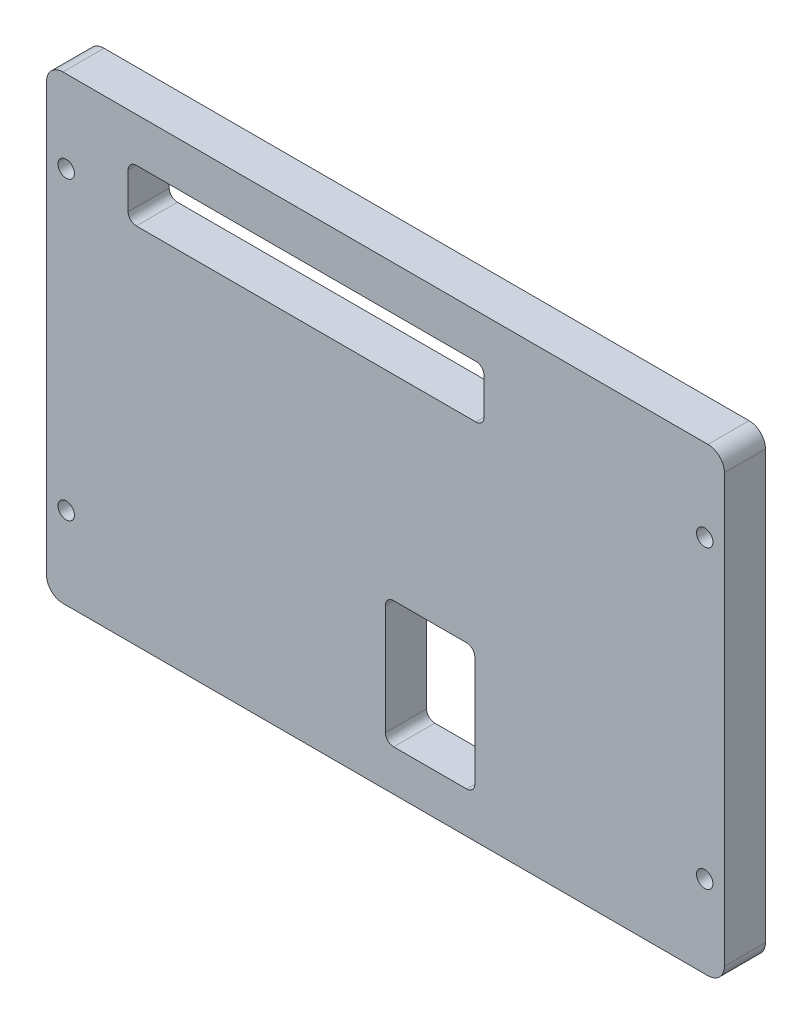
ISO-10303-21;
HEADER;
FILE_DESCRIPTION(('STEP AP214'),'2;1');
FILE_NAME('part.step','',(''),(''),'','','');
FILE_SCHEMA(('AUTOMOTIVE_DESIGN { 1 0 10303 214 1 1 1 1 }'));
ENDSEC;
DATA;
#1=APPLICATION_CONTEXT('core data for automotive mechanical design processes');
#2=APPLICATION_PROTOCOL_DEFINITION('international standard','automotive_design',2000,#1);
#3=PRODUCT_CONTEXT('',#1,'mechanical');
#4=PRODUCT('Part','Part','',(#3));
#5=PRODUCT_RELATED_PRODUCT_CATEGORY('part','',(#4));
#6=PRODUCT_DEFINITION_FORMATION('','',#4);
#7=PRODUCT_DEFINITION_CONTEXT('part definition',#1,'design');
#8=PRODUCT_DEFINITION('design','',#6,#7);
#9=PRODUCT_DEFINITION_SHAPE('','',#8);
#10=(LENGTH_UNIT() NAMED_UNIT(*) SI_UNIT(.MILLI.,.METRE.));
#11=(NAMED_UNIT(*) PLANE_ANGLE_UNIT() SI_UNIT($,.RADIAN.));
#12=(NAMED_UNIT(*) SI_UNIT($,.STERADIAN.) SOLID_ANGLE_UNIT());
#13=UNCERTAINTY_MEASURE_WITH_UNIT(LENGTH_MEASURE(1.E-05),#10,'distance_accuracy_value','');
#14=(GEOMETRIC_REPRESENTATION_CONTEXT(3) GLOBAL_UNCERTAINTY_ASSIGNED_CONTEXT((#13)) GLOBAL_UNIT_ASSIGNED_CONTEXT((#10,
#11,#12)) REPRESENTATION_CONTEXT('',''));
#15=CARTESIAN_POINT('',(0.,0.,0.));
#16=DIRECTION('',(0.,0.,1.));
#17=DIRECTION('',(1.,0.,0.));
#18=AXIS2_PLACEMENT_3D('',#15,#16,#17);
#19=CARTESIAN_POINT('',(49.8475,-33.02,6.35));
#20=DIRECTION('',(0.,0.,1.));
#21=DIRECTION('',(1.,0.,0.));
#22=AXIS2_PLACEMENT_3D('',#19,#20,#21);
#23=PLANE('',#22);
#24=CARTESIAN_POINT('',(49.3395,-22.86,6.35));
#25=DIRECTION('',(0.,0.,1.));
#26=DIRECTION('',(1.,0.,0.));
#27=AXIS2_PLACEMENT_3D('',#24,#25,#26);
#28=CIRCLE('',#27,1.27);
#29=CARTESIAN_POINT('',(50.6095,-22.86,6.35));
#30=VERTEX_POINT('',#29);
#31=EDGE_CURVE('E653',#30,#30,#28,.T.);
#32=ORIENTED_EDGE('',*,*,#31,.F.);
#33=EDGE_LOOP('',(#32));
#34=FACE_BOUND('',#33,.T.);
#35=CARTESIAN_POINT('',(49.3395,22.86,6.35));
#36=DIRECTION('',(0.,0.,1.));
#37=DIRECTION('',(1.,0.,0.));
#38=AXIS2_PLACEMENT_3D('',#35,#36,#37);
#39=CIRCLE('',#38,1.27);
#40=CARTESIAN_POINT('',(50.6095,22.86,6.35));
#41=VERTEX_POINT('',#40);
#42=EDGE_CURVE('E657',#41,#41,#39,.T.);
#43=ORIENTED_EDGE('',*,*,#42,.F.);
#44=EDGE_LOOP('',(#43));
#45=FACE_BOUND('',#44,.T.);
#46=CARTESIAN_POINT('',(-49.3395,22.86,6.35));
#47=DIRECTION('',(0.,0.,1.));
#48=DIRECTION('',(1.,0.,0.));
#49=AXIS2_PLACEMENT_3D('',#46,#47,#48);
#50=CIRCLE('',#49,1.27);
#51=CARTESIAN_POINT('',(-48.0695,22.86,6.35));
#52=VERTEX_POINT('',#51);
#53=EDGE_CURVE('E665',#52,#52,#50,.T.);
#54=ORIENTED_EDGE('',*,*,#53,.F.);
#55=EDGE_LOOP('',(#54));
#56=FACE_BOUND('',#55,.T.);
#57=CARTESIAN_POINT('',(-49.3395,-22.86,6.35));
#58=DIRECTION('',(0.,0.,1.));
#59=DIRECTION('',(1.,0.,0.));
#60=AXIS2_PLACEMENT_3D('',#57,#58,#59);
#61=CIRCLE('',#60,1.27);
#62=CARTESIAN_POINT('',(-48.0695,-22.86,6.35));
#63=VERTEX_POINT('',#62);
#64=EDGE_CURVE('E663',#63,#63,#61,.T.);
#65=ORIENTED_EDGE('',*,*,#64,.F.);
#66=EDGE_LOOP('',(#65));
#67=FACE_BOUND('',#66,.T.);
#68=CARTESIAN_POINT('',(49.8475,-33.02,6.35));
#69=DIRECTION('',(0.,0.,1.));
#70=DIRECTION('',(1.,0.,0.));
#71=AXIS2_PLACEMENT_3D('',#68,#69,#70);
#72=CIRCLE('',#71,2.54);
#73=CARTESIAN_POINT('',(49.8475,-35.56,6.35));
#74=VERTEX_POINT('',#73);
#75=CARTESIAN_POINT('',(52.3875,-33.02,6.35));
#76=VERTEX_POINT('',#75);
#77=EDGE_CURVE('E326',#74,#76,#72,.T.);
#78=ORIENTED_EDGE('',*,*,#77,.T.);
#79=DIRECTION('',(0.,1.,0.));
#80=VECTOR('',#79,1.);
#81=CARTESIAN_POINT('',(52.3875,-33.02,6.35));
#82=LINE('',#81,#80);
#83=CARTESIAN_POINT('',(52.3875,33.02,6.35));
#84=VERTEX_POINT('',#83);
#85=EDGE_CURVE('E329',#76,#84,#82,.T.);
#86=ORIENTED_EDGE('',*,*,#85,.T.);
#87=CARTESIAN_POINT('',(49.8475,33.02,6.35));
#88=DIRECTION('',(0.,0.,1.));
#89=DIRECTION('',(1.,0.,0.));
#90=AXIS2_PLACEMENT_3D('',#87,#88,#89);
#91=CIRCLE('',#90,2.54);
#92=CARTESIAN_POINT('',(49.8475,35.56,6.35));
#93=VERTEX_POINT('',#92);
#94=EDGE_CURVE('E332',#84,#93,#91,.T.);
#95=ORIENTED_EDGE('',*,*,#94,.T.);
#96=DIRECTION('',(-1.,0.,0.));
#97=VECTOR('',#96,1.);
#98=CARTESIAN_POINT('',(49.8475,35.56,6.35));
#99=LINE('',#98,#97);
#100=CARTESIAN_POINT('',(-49.8475,35.56,6.35));
#101=VERTEX_POINT('',#100);
#102=EDGE_CURVE('E334',#93,#101,#99,.T.);
#103=ORIENTED_EDGE('',*,*,#102,.T.);
#104=CARTESIAN_POINT('',(-49.8475,33.02,6.35));
#105=DIRECTION('',(0.,0.,1.));
#106=DIRECTION('',(1.,0.,0.));
#107=AXIS2_PLACEMENT_3D('',#104,#105,#106);
#108=CIRCLE('',#107,2.54);
#109=CARTESIAN_POINT('',(-52.3875,33.02,6.35));
#110=VERTEX_POINT('',#109);
#111=EDGE_CURVE('E336',#101,#110,#108,.T.);
#112=ORIENTED_EDGE('',*,*,#111,.T.);
#113=DIRECTION('',(0.,-1.,0.));
#114=VECTOR('',#113,1.);
#115=CARTESIAN_POINT('',(-52.3875,33.02,6.35));
#116=LINE('',#115,#114);
#117=CARTESIAN_POINT('',(-52.3875,-33.02,6.35));
#118=VERTEX_POINT('',#117);
#119=EDGE_CURVE('E338',#110,#118,#116,.T.);
#120=ORIENTED_EDGE('',*,*,#119,.T.);
#121=CARTESIAN_POINT('',(-49.8475,-33.02,6.35));
#122=DIRECTION('',(0.,0.,1.));
#123=DIRECTION('',(1.,0.,0.));
#124=AXIS2_PLACEMENT_3D('',#121,#122,#123);
#125=CIRCLE('',#124,2.54);
#126=CARTESIAN_POINT('',(-49.8475,-35.56,6.35));
#127=VERTEX_POINT('',#126);
#128=EDGE_CURVE('E340',#118,#127,#125,.T.);
#129=ORIENTED_EDGE('',*,*,#128,.T.);
#130=DIRECTION('',(1.,0.,0.));
#131=VECTOR('',#130,1.);
#132=CARTESIAN_POINT('',(-49.8475,-35.56,6.35));
#133=LINE('',#132,#131);
#134=EDGE_CURVE('E342',#127,#74,#133,.T.);
#135=ORIENTED_EDGE('',*,*,#134,.T.);
#136=EDGE_LOOP('',(#78,#86,#95,#103,#112,#120,#129,#135));
#137=FACE_BOUND('',#136,.T.);
#138=DIRECTION('',(0.,-1.,0.));
#139=VECTOR('',#138,1.);
#140=CARTESIAN_POINT('',(0.,-10.9162434669983,6.35));
#141=LINE('',#140,#139);
#142=CARTESIAN_POINT('',(0.,-10.9162434669983,6.35));
#143=VERTEX_POINT('',#142);
#144=CARTESIAN_POINT('',(0.,-27.94,6.35));
#145=VERTEX_POINT('',#144);
#146=EDGE_CURVE('E269',#143,#145,#141,.T.);
#147=ORIENTED_EDGE('',*,*,#146,.F.);
#148=CARTESIAN_POINT('',(1.27,-10.9162434669983,6.35));
#149=DIRECTION('',(0.,0.,1.));
#150=DIRECTION('',(1.,0.,0.));
#151=AXIS2_PLACEMENT_3D('',#148,#149,#150);
#152=CIRCLE('',#151,1.27);
#153=CARTESIAN_POINT('',(1.27000000000001,-9.64624346699828,6.35));
#154=VERTEX_POINT('',#153);
#155=EDGE_CURVE('E267',#154,#143,#152,.T.);
#156=ORIENTED_EDGE('',*,*,#155,.F.);
#157=DIRECTION('',(-1.,0.,0.));
#158=VECTOR('',#157,1.);
#159=CARTESIAN_POINT('',(1.27000000000001,-9.64624346699828,6.35));
#160=LINE('',#159,#158);
#161=CARTESIAN_POINT('',(12.5395183825614,-9.64624346699828,6.35));
#162=VERTEX_POINT('',#161);
#163=EDGE_CURVE('E283',#162,#154,#160,.T.);
#164=ORIENTED_EDGE('',*,*,#163,.F.);
#165=CARTESIAN_POINT('',(12.5395183825614,-10.9162434669983,6.35));
#166=DIRECTION('',(0.,0.,1.));
#167=DIRECTION('',(-1.,0.,0.));
#168=AXIS2_PLACEMENT_3D('',#165,#166,#167);
#169=CIRCLE('',#168,1.27);
#170=CARTESIAN_POINT('',(13.8095183825614,-10.9162434669983,6.35));
#171=VERTEX_POINT('',#170);
#172=EDGE_CURVE('E280',#171,#162,#169,.T.);
#173=ORIENTED_EDGE('',*,*,#172,.F.);
#174=DIRECTION('',(0.,1.,0.));
#175=VECTOR('',#174,1.);
#176=CARTESIAN_POINT('',(13.8095183825614,-10.9162434669983,6.35));
#177=LINE('',#176,#175);
#178=CARTESIAN_POINT('',(13.8095183825614,-27.94,6.35));
#179=VERTEX_POINT('',#178);
#180=EDGE_CURVE('E278',#179,#171,#177,.T.);
#181=ORIENTED_EDGE('',*,*,#180,.F.);
#182=CARTESIAN_POINT('',(12.5395183825614,-27.94,6.35));
#183=DIRECTION('',(0.,0.,1.));
#184=DIRECTION('',(1.,0.,0.));
#185=AXIS2_PLACEMENT_3D('',#182,#183,#184);
#186=CIRCLE('',#185,1.27);
#187=CARTESIAN_POINT('',(12.5395183825614,-29.21,6.35));
#188=VERTEX_POINT('',#187);
#189=EDGE_CURVE('E276',#188,#179,#186,.T.);
#190=ORIENTED_EDGE('',*,*,#189,.F.);
#191=DIRECTION('',(1.,0.,0.));
#192=VECTOR('',#191,1.);
#193=CARTESIAN_POINT('',(1.27000000000001,-29.21,6.35));
#194=LINE('',#193,#192);
#195=CARTESIAN_POINT('',(1.27000000000001,-29.21,6.35));
#196=VERTEX_POINT('',#195);
#197=EDGE_CURVE('E274',#196,#188,#194,.T.);
#198=ORIENTED_EDGE('',*,*,#197,.F.);
#199=CARTESIAN_POINT('',(1.27,-27.94,6.35));
#200=DIRECTION('',(0.,0.,1.));
#201=DIRECTION('',(1.,0.,0.));
#202=AXIS2_PLACEMENT_3D('',#199,#200,#201);
#203=CIRCLE('',#202,1.27);
#204=EDGE_CURVE('E272',#145,#196,#203,.T.);
#205=ORIENTED_EDGE('',*,*,#204,.F.);
#206=EDGE_LOOP('',(#147,#156,#164,#173,#181,#190,#198,#205));
#207=FACE_BOUND('',#206,.T.);
#208=DIRECTION('',(0.,-1.,0.));
#209=VECTOR('',#208,1.);
#210=CARTESIAN_POINT('',(-39.7723246205913,27.4662186761289,6.35));
#211=LINE('',#210,#209);
#212=CARTESIAN_POINT('',(-39.7723246205913,27.4662186761289,6.35));
#213=VERTEX_POINT('',#212);
#214=CARTESIAN_POINT('',(-39.7723246205913,21.8946585596287,6.35));
#215=VERTEX_POINT('',#214);
#216=EDGE_CURVE('E208',#213,#215,#211,.T.);
#217=ORIENTED_EDGE('',*,*,#216,.F.);
#218=CARTESIAN_POINT('',(-38.5023246205913,27.4662186761289,6.35));
#219=DIRECTION('',(0.,0.,1.));
#220=DIRECTION('',(1.,0.,0.));
#221=AXIS2_PLACEMENT_3D('',#218,#219,#220);
#222=CIRCLE('',#221,1.27);
#223=CARTESIAN_POINT('',(-38.5023246205913,28.7362186761289,6.35));
#224=VERTEX_POINT('',#223);
#225=EDGE_CURVE('E200',#224,#213,#222,.T.);
#226=ORIENTED_EDGE('',*,*,#225,.F.);
#227=DIRECTION('',(-1.,0.,0.));
#228=VECTOR('',#227,1.);
#229=CARTESIAN_POINT('',(-38.5023246205913,28.7362186761289,6.35));
#230=LINE('',#229,#228);
#231=CARTESIAN_POINT('',(13.9716720144704,28.7362186761289,6.35));
#232=VERTEX_POINT('',#231);
#233=EDGE_CURVE('E234',#232,#224,#230,.T.);
#234=ORIENTED_EDGE('',*,*,#233,.F.);
#235=CARTESIAN_POINT('',(13.9716720144705,27.4662186761289,6.35));
#236=DIRECTION('',(0.,0.,1.));
#237=DIRECTION('',(-1.,0.,0.));
#238=AXIS2_PLACEMENT_3D('',#235,#236,#237);
#239=CIRCLE('',#238,1.27);
#240=CARTESIAN_POINT('',(15.2416720144705,27.4662186761289,6.35));
#241=VERTEX_POINT('',#240);
#242=EDGE_CURVE('E232',#241,#232,#239,.T.);
#243=ORIENTED_EDGE('',*,*,#242,.F.);
#244=DIRECTION('',(0.,1.,0.));
#245=VECTOR('',#244,1.);
#246=CARTESIAN_POINT('',(15.2416720144705,27.4662186761289,6.35));
#247=LINE('',#246,#245);
#248=CARTESIAN_POINT('',(15.2416720144705,21.8946585596287,6.35));
#249=VERTEX_POINT('',#248);
#250=EDGE_CURVE('E230',#249,#241,#247,.T.);
#251=ORIENTED_EDGE('',*,*,#250,.F.);
#252=CARTESIAN_POINT('',(13.9716720144705,21.8946585596287,6.35));
#253=DIRECTION('',(0.,0.,1.));
#254=DIRECTION('',(1.,0.,0.));
#255=AXIS2_PLACEMENT_3D('',#252,#253,#254);
#256=CIRCLE('',#255,1.27);
#257=CARTESIAN_POINT('',(13.9716720144705,20.6246585596287,6.35));
#258=VERTEX_POINT('',#257);
#259=EDGE_CURVE('E228',#258,#249,#256,.T.);
#260=ORIENTED_EDGE('',*,*,#259,.F.);
#261=DIRECTION('',(1.,0.,0.));
#262=VECTOR('',#261,1.);
#263=CARTESIAN_POINT('',(-38.5023246205913,20.6246585596287,6.35));
#264=LINE('',#263,#262);
#265=CARTESIAN_POINT('',(-38.5023246205913,20.6246585596287,6.35));
#266=VERTEX_POINT('',#265);
#267=EDGE_CURVE('E223',#266,#258,#264,.T.);
#268=ORIENTED_EDGE('',*,*,#267,.F.);
#269=CARTESIAN_POINT('',(-38.5023246205913,21.8946585596287,6.35));
#270=DIRECTION('',(0.,0.,1.));
#271=DIRECTION('',(1.,0.,0.));
#272=AXIS2_PLACEMENT_3D('',#269,#270,#271);
#273=CIRCLE('',#272,1.27);
#274=EDGE_CURVE('E221',#215,#266,#273,.T.);
#275=ORIENTED_EDGE('',*,*,#274,.F.);
#276=EDGE_LOOP('',(#217,#226,#234,#243,#251,#260,#268,#275));
#277=FACE_BOUND('',#276,.T.);
#278=ADVANCED_FACE('F39',(#34,#45,#56,#67,#137,#207,#277),#23,.T.);
#279=CARTESIAN_POINT('',(49.8475,-33.02,0.));
#280=DIRECTION('',(0.,0.,1.));
#281=DIRECTION('',(1.,0.,0.));
#282=AXIS2_PLACEMENT_3D('',#279,#280,#281);
#283=PLANE('',#282);
#284=CARTESIAN_POINT('',(49.3395,-22.86,0.));
#285=DIRECTION('',(0.,0.,1.));
#286=DIRECTION('',(1.,0.,0.));
#287=AXIS2_PLACEMENT_3D('',#284,#285,#286);
#288=CIRCLE('',#287,1.27);
#289=CARTESIAN_POINT('',(50.6095,-22.86,0.));
#290=VERTEX_POINT('',#289);
#291=EDGE_CURVE('E651',#290,#290,#288,.T.);
#292=ORIENTED_EDGE('',*,*,#291,.T.);
#293=EDGE_LOOP('',(#292));
#294=FACE_BOUND('',#293,.T.);
#295=CARTESIAN_POINT('',(49.3395,22.86,0.));
#296=DIRECTION('',(0.,0.,1.));
#297=DIRECTION('',(1.,0.,0.));
#298=AXIS2_PLACEMENT_3D('',#295,#296,#297);
#299=CIRCLE('',#298,1.27);
#300=CARTESIAN_POINT('',(50.6095,22.86,0.));
#301=VERTEX_POINT('',#300);
#302=EDGE_CURVE('E654',#301,#301,#299,.T.);
#303=ORIENTED_EDGE('',*,*,#302,.T.);
#304=EDGE_LOOP('',(#303));
#305=FACE_BOUND('',#304,.T.);
#306=CARTESIAN_POINT('',(-49.3395,22.86,0.));
#307=DIRECTION('',(0.,0.,1.));
#308=DIRECTION('',(1.,0.,0.));
#309=AXIS2_PLACEMENT_3D('',#306,#307,#308);
#310=CIRCLE('',#309,1.27);
#311=CARTESIAN_POINT('',(-48.0695,22.86,0.));
#312=VERTEX_POINT('',#311);
#313=EDGE_CURVE('E669',#312,#312,#310,.T.);
#314=ORIENTED_EDGE('',*,*,#313,.T.);
#315=EDGE_LOOP('',(#314));
#316=FACE_BOUND('',#315,.T.);
#317=CARTESIAN_POINT('',(-49.3395,-22.86,0.));
#318=DIRECTION('',(0.,0.,1.));
#319=DIRECTION('',(1.,0.,0.));
#320=AXIS2_PLACEMENT_3D('',#317,#318,#319);
#321=CIRCLE('',#320,1.27);
#322=CARTESIAN_POINT('',(-48.0695,-22.86,0.));
#323=VERTEX_POINT('',#322);
#324=EDGE_CURVE('E237',#323,#323,#321,.T.);
#325=ORIENTED_EDGE('',*,*,#324,.T.);
#326=EDGE_LOOP('',(#325));
#327=FACE_BOUND('',#326,.T.);
#328=CARTESIAN_POINT('',(1.27,-10.9162434669983,0.));
#329=DIRECTION('',(0.,0.,1.));
#330=DIRECTION('',(1.,0.,0.));
#331=AXIS2_PLACEMENT_3D('',#328,#329,#330);
#332=CIRCLE('',#331,1.27);
#333=CARTESIAN_POINT('',(1.27000000000001,-9.64624346699828,0.));
#334=VERTEX_POINT('',#333);
#335=CARTESIAN_POINT('',(0.,-10.9162434669983,0.));
#336=VERTEX_POINT('',#335);
#337=EDGE_CURVE('E216',#334,#336,#332,.T.);
#338=ORIENTED_EDGE('',*,*,#337,.T.);
#339=DIRECTION('',(0.,-1.,0.));
#340=VECTOR('',#339,1.);
#341=CARTESIAN_POINT('',(0.,-10.9162434669983,0.));
#342=LINE('',#341,#340);
#343=CARTESIAN_POINT('',(0.,-27.94,0.));
#344=VERTEX_POINT('',#343);
#345=EDGE_CURVE('E288',#336,#344,#342,.T.);
#346=ORIENTED_EDGE('',*,*,#345,.T.);
#347=CARTESIAN_POINT('',(1.27,-27.94,0.));
#348=DIRECTION('',(0.,0.,1.));
#349=DIRECTION('',(1.,0.,0.));
#350=AXIS2_PLACEMENT_3D('',#347,#348,#349);
#351=CIRCLE('',#350,1.27);
#352=CARTESIAN_POINT('',(1.27000000000001,-29.21,0.));
#353=VERTEX_POINT('',#352);
#354=EDGE_CURVE('E291',#344,#353,#351,.T.);
#355=ORIENTED_EDGE('',*,*,#354,.T.);
#356=DIRECTION('',(1.,0.,0.));
#357=VECTOR('',#356,1.);
#358=CARTESIAN_POINT('',(1.27000000000001,-29.21,0.));
#359=LINE('',#358,#357);
#360=CARTESIAN_POINT('',(12.5395183825614,-29.21,0.));
#361=VERTEX_POINT('',#360);
#362=EDGE_CURVE('E294',#353,#361,#359,.T.);
#363=ORIENTED_EDGE('',*,*,#362,.T.);
#364=CARTESIAN_POINT('',(12.5395183825614,-27.94,0.));
#365=DIRECTION('',(0.,0.,1.));
#366=DIRECTION('',(1.,0.,0.));
#367=AXIS2_PLACEMENT_3D('',#364,#365,#366);
#368=CIRCLE('',#367,1.27);
#369=CARTESIAN_POINT('',(13.8095183825614,-27.94,0.));
#370=VERTEX_POINT('',#369);
#371=EDGE_CURVE('E297',#361,#370,#368,.T.);
#372=ORIENTED_EDGE('',*,*,#371,.T.);
#373=DIRECTION('',(0.,1.,0.));
#374=VECTOR('',#373,1.);
#375=CARTESIAN_POINT('',(13.8095183825614,-10.9162434669983,0.));
#376=LINE('',#375,#374);
#377=CARTESIAN_POINT('',(13.8095183825614,-10.9162434669983,0.));
#378=VERTEX_POINT('',#377);
#379=EDGE_CURVE('E300',#370,#378,#376,.T.);
#380=ORIENTED_EDGE('',*,*,#379,.T.);
#381=CARTESIAN_POINT('',(12.5395183825614,-10.9162434669983,0.));
#382=DIRECTION('',(0.,0.,1.));
#383=DIRECTION('',(-1.,0.,0.));
#384=AXIS2_PLACEMENT_3D('',#381,#382,#383);
#385=CIRCLE('',#384,1.27);
#386=CARTESIAN_POINT('',(12.5395183825614,-9.64624346699828,0.));
#387=VERTEX_POINT('',#386);
#388=EDGE_CURVE('E303',#378,#387,#385,.T.);
#389=ORIENTED_EDGE('',*,*,#388,.T.);
#390=DIRECTION('',(-1.,0.,0.));
#391=VECTOR('',#390,1.);
#392=CARTESIAN_POINT('',(1.27000000000001,-9.64624346699828,0.));
#393=LINE('',#392,#391);
#394=EDGE_CURVE('E270',#387,#334,#393,.T.);
#395=ORIENTED_EDGE('',*,*,#394,.T.);
#396=EDGE_LOOP('',(#338,#346,#355,#363,#372,#380,#389,#395));
#397=FACE_BOUND('',#396,.T.);
#398=CARTESIAN_POINT('',(49.8475,-33.02,0.));
#399=DIRECTION('',(0.,0.,1.));
#400=DIRECTION('',(1.,0.,0.));
#401=AXIS2_PLACEMENT_3D('',#398,#399,#400);
#402=CIRCLE('',#401,2.54);
#403=CARTESIAN_POINT('',(49.8475,-35.56,0.));
#404=VERTEX_POINT('',#403);
#405=CARTESIAN_POINT('',(52.3875,-33.02,0.));
#406=VERTEX_POINT('',#405);
#407=EDGE_CURVE('E325',#404,#406,#402,.T.);
#408=ORIENTED_EDGE('',*,*,#407,.F.);
#409=DIRECTION('',(1.,0.,0.));
#410=VECTOR('',#409,1.);
#411=CARTESIAN_POINT('',(-49.8475,-35.56,0.));
#412=LINE('',#411,#410);
#413=CARTESIAN_POINT('',(-49.8475,-35.56,0.));
#414=VERTEX_POINT('',#413);
#415=EDGE_CURVE('E330',#414,#404,#412,.T.);
#416=ORIENTED_EDGE('',*,*,#415,.F.);
#417=CARTESIAN_POINT('',(-49.8475,-33.02,0.));
#418=DIRECTION('',(0.,0.,1.));
#419=DIRECTION('',(1.,0.,0.));
#420=AXIS2_PLACEMENT_3D('',#417,#418,#419);
#421=CIRCLE('',#420,2.54);
#422=CARTESIAN_POINT('',(-52.3875,-33.02,0.));
#423=VERTEX_POINT('',#422);
#424=EDGE_CURVE('E357',#423,#414,#421,.T.);
#425=ORIENTED_EDGE('',*,*,#424,.F.);
#426=DIRECTION('',(0.,-1.,0.));
#427=VECTOR('',#426,1.);
#428=CARTESIAN_POINT('',(-52.3875,33.02,0.));
#429=LINE('',#428,#427);
#430=CARTESIAN_POINT('',(-52.3875,33.02,0.));
#431=VERTEX_POINT('',#430);
#432=EDGE_CURVE('E355',#431,#423,#429,.T.);
#433=ORIENTED_EDGE('',*,*,#432,.F.);
#434=CARTESIAN_POINT('',(-49.8475,33.02,0.));
#435=DIRECTION('',(0.,0.,1.));
#436=DIRECTION('',(1.,0.,0.));
#437=AXIS2_PLACEMENT_3D('',#434,#435,#436);
#438=CIRCLE('',#437,2.54);
#439=CARTESIAN_POINT('',(-49.8475,35.56,0.));
#440=VERTEX_POINT('',#439);
#441=EDGE_CURVE('E353',#440,#431,#438,.T.);
#442=ORIENTED_EDGE('',*,*,#441,.F.);
#443=DIRECTION('',(-1.,0.,0.));
#444=VECTOR('',#443,1.);
#445=CARTESIAN_POINT('',(49.8475,35.56,0.));
#446=LINE('',#445,#444);
#447=CARTESIAN_POINT('',(49.8475,35.56,0.));
#448=VERTEX_POINT('',#447);
#449=EDGE_CURVE('E351',#448,#440,#446,.T.);
#450=ORIENTED_EDGE('',*,*,#449,.F.);
#451=CARTESIAN_POINT('',(49.8475,33.02,0.));
#452=DIRECTION('',(0.,0.,1.));
#453=DIRECTION('',(1.,0.,0.));
#454=AXIS2_PLACEMENT_3D('',#451,#452,#453);
#455=CIRCLE('',#454,2.54);
#456=CARTESIAN_POINT('',(52.3875,33.02,0.));
#457=VERTEX_POINT('',#456);
#458=EDGE_CURVE('E349',#457,#448,#455,.T.);
#459=ORIENTED_EDGE('',*,*,#458,.F.);
#460=DIRECTION('',(0.,1.,0.));
#461=VECTOR('',#460,1.);
#462=CARTESIAN_POINT('',(52.3875,-33.02,0.));
#463=LINE('',#462,#461);
#464=EDGE_CURVE('E347',#406,#457,#463,.T.);
#465=ORIENTED_EDGE('',*,*,#464,.F.);
#466=EDGE_LOOP('',(#408,#416,#425,#433,#442,#450,#459,#465));
#467=FACE_BOUND('',#466,.T.);
#468=CARTESIAN_POINT('',(-38.5023246205913,27.4662186761289,0.));
#469=DIRECTION('',(0.,0.,1.));
#470=DIRECTION('',(1.,0.,0.));
#471=AXIS2_PLACEMENT_3D('',#468,#469,#470);
#472=CIRCLE('',#471,1.27);
#473=CARTESIAN_POINT('',(-38.5023246205913,28.7362186761289,0.));
#474=VERTEX_POINT('',#473);
#475=CARTESIAN_POINT('',(-39.7723246205913,27.4662186761289,0.));
#476=VERTEX_POINT('',#475);
#477=EDGE_CURVE('E62',#474,#476,#472,.T.);
#478=ORIENTED_EDGE('',*,*,#477,.T.);
#479=DIRECTION('',(0.,-1.,0.));
#480=VECTOR('',#479,1.);
#481=CARTESIAN_POINT('',(-39.7723246205913,27.4662186761289,0.));
#482=LINE('',#481,#480);
#483=CARTESIAN_POINT('',(-39.7723246205913,21.8946585596287,0.));
#484=VERTEX_POINT('',#483);
#485=EDGE_CURVE('E215',#476,#484,#482,.T.);
#486=ORIENTED_EDGE('',*,*,#485,.T.);
#487=CARTESIAN_POINT('',(-38.5023246205913,21.8946585596287,0.));
#488=DIRECTION('',(0.,0.,1.));
#489=DIRECTION('',(1.,0.,0.));
#490=AXIS2_PLACEMENT_3D('',#487,#488,#489);
#491=CIRCLE('',#490,1.27);
#492=CARTESIAN_POINT('',(-38.5023246205913,20.6246585596287,0.));
#493=VERTEX_POINT('',#492);
#494=EDGE_CURVE('E239',#484,#493,#491,.T.);
#495=ORIENTED_EDGE('',*,*,#494,.T.);
#496=DIRECTION('',(1.,0.,0.));
#497=VECTOR('',#496,1.);
#498=CARTESIAN_POINT('',(-38.5023246205913,20.6246585596287,0.));
#499=LINE('',#498,#497);
#500=CARTESIAN_POINT('',(13.9716720144705,20.6246585596287,0.));
#501=VERTEX_POINT('',#500);
#502=EDGE_CURVE('E242',#493,#501,#499,.T.);
#503=ORIENTED_EDGE('',*,*,#502,.T.);
#504=CARTESIAN_POINT('',(13.9716720144705,21.8946585596287,0.));
#505=DIRECTION('',(0.,0.,1.));
#506=DIRECTION('',(1.,0.,0.));
#507=AXIS2_PLACEMENT_3D('',#504,#505,#506);
#508=CIRCLE('',#507,1.27);
#509=CARTESIAN_POINT('',(15.2416720144705,21.8946585596287,0.));
#510=VERTEX_POINT('',#509);
#511=EDGE_CURVE('E245',#501,#510,#508,.T.);
#512=ORIENTED_EDGE('',*,*,#511,.T.);
#513=DIRECTION('',(0.,1.,0.));
#514=VECTOR('',#513,1.);
#515=CARTESIAN_POINT('',(15.2416720144705,27.4662186761289,0.));
#516=LINE('',#515,#514);
#517=CARTESIAN_POINT('',(15.2416720144705,27.4662186761289,0.));
#518=VERTEX_POINT('',#517);
#519=EDGE_CURVE('E248',#510,#518,#516,.T.);
#520=ORIENTED_EDGE('',*,*,#519,.T.);
#521=CARTESIAN_POINT('',(13.9716720144705,27.4662186761289,0.));
#522=DIRECTION('',(0.,0.,1.));
#523=DIRECTION('',(-1.,0.,0.));
#524=AXIS2_PLACEMENT_3D('',#521,#522,#523);
#525=CIRCLE('',#524,1.27);
#526=CARTESIAN_POINT('',(13.9716720144705,28.7362186761289,0.));
#527=VERTEX_POINT('',#526);
#528=EDGE_CURVE('E251',#518,#527,#525,.T.);
#529=ORIENTED_EDGE('',*,*,#528,.T.);
#530=DIRECTION('',(-1.,0.,0.));
#531=VECTOR('',#530,1.);
#532=CARTESIAN_POINT('',(-38.5023246205913,28.7362186761289,0.));
#533=LINE('',#532,#531);
#534=EDGE_CURVE('E209',#527,#474,#533,.T.);
#535=ORIENTED_EDGE('',*,*,#534,.T.);
#536=EDGE_LOOP('',(#478,#486,#495,#503,#512,#520,#529,#535));
#537=FACE_BOUND('',#536,.T.);
#538=ADVANCED_FACE('F387',(#294,#305,#316,#327,#397,#467,#537),#283,.F.);
#539=CARTESIAN_POINT('',(49.8475,-33.02,6.35));
#540=DIRECTION('',(0.,0.,-1.));
#541=DIRECTION('',(-1.,0.,0.));
#542=AXIS2_PLACEMENT_3D('',#539,#540,#541);
#543=CYLINDRICAL_SURFACE('',#542,2.54);
#544=ORIENTED_EDGE('',*,*,#407,.T.);
#545=DIRECTION('',(0.,0.,-1.));
#546=VECTOR('',#545,1.);
#547=CARTESIAN_POINT('',(52.3875,-33.02,6.35));
#548=LINE('',#547,#546);
#549=EDGE_CURVE('E11',#76,#406,#548,.T.);
#550=ORIENTED_EDGE('',*,*,#549,.F.);
#551=ORIENTED_EDGE('',*,*,#77,.F.);
#552=DIRECTION('',(0.,0.,-1.));
#553=VECTOR('',#552,1.);
#554=CARTESIAN_POINT('',(49.8475,-35.56,6.35));
#555=LINE('',#554,#553);
#556=EDGE_CURVE('E344',#74,#404,#555,.T.);
#557=ORIENTED_EDGE('',*,*,#556,.T.);
#558=EDGE_LOOP('',(#544,#550,#551,#557));
#559=FACE_BOUND('',#558,.T.);
#560=ADVANCED_FACE('F41',(#559),#543,.T.);
#561=CARTESIAN_POINT('',(52.3875,-33.02,6.35));
#562=DIRECTION('',(-1.,0.,0.));
#563=DIRECTION('',(0.,0.,1.));
#564=AXIS2_PLACEMENT_3D('',#561,#562,#563);
#565=PLANE('',#564);
#566=ORIENTED_EDGE('',*,*,#464,.T.);
#567=DIRECTION('',(0.,0.,-1.));
#568=VECTOR('',#567,1.);
#569=CARTESIAN_POINT('',(52.3875,33.02,6.35));
#570=LINE('',#569,#568);
#571=EDGE_CURVE('E47',#84,#457,#570,.T.);
#572=ORIENTED_EDGE('',*,*,#571,.F.);
#573=ORIENTED_EDGE('',*,*,#85,.F.);
#574=ORIENTED_EDGE('',*,*,#549,.T.);
#575=EDGE_LOOP('',(#566,#572,#573,#574));
#576=FACE_BOUND('',#575,.T.);
#577=ADVANCED_FACE('F405',(#576),#565,.F.);
#578=CARTESIAN_POINT('',(49.8475,33.02,6.35));
#579=DIRECTION('',(0.,0.,-1.));
#580=DIRECTION('',(-1.,0.,0.));
#581=AXIS2_PLACEMENT_3D('',#578,#579,#580);
#582=CYLINDRICAL_SURFACE('',#581,2.54);
#583=ORIENTED_EDGE('',*,*,#458,.T.);
#584=DIRECTION('',(0.,0.,-1.));
#585=VECTOR('',#584,1.);
#586=CARTESIAN_POINT('',(49.8475,35.56,6.35));
#587=LINE('',#586,#585);
#588=EDGE_CURVE('E374',#93,#448,#587,.T.);
#589=ORIENTED_EDGE('',*,*,#588,.F.);
#590=ORIENTED_EDGE('',*,*,#94,.F.);
#591=ORIENTED_EDGE('',*,*,#571,.T.);
#592=EDGE_LOOP('',(#583,#589,#590,#591));
#593=FACE_BOUND('',#592,.T.);
#594=ADVANCED_FACE('F381',(#593),#582,.T.);
#595=CARTESIAN_POINT('',(49.8475,35.56,6.35));
#596=DIRECTION('',(0.,-1.,0.));
#597=DIRECTION('',(0.,0.,-1.));
#598=AXIS2_PLACEMENT_3D('',#595,#596,#597);
#599=PLANE('',#598);
#600=ORIENTED_EDGE('',*,*,#449,.T.);
#601=DIRECTION('',(0.,0.,-1.));
#602=VECTOR('',#601,1.);
#603=CARTESIAN_POINT('',(-49.8475,35.56,6.35));
#604=LINE('',#603,#602);
#605=EDGE_CURVE('E371',#101,#440,#604,.T.);
#606=ORIENTED_EDGE('',*,*,#605,.F.);
#607=ORIENTED_EDGE('',*,*,#102,.F.);
#608=ORIENTED_EDGE('',*,*,#588,.T.);
#609=EDGE_LOOP('',(#600,#606,#607,#608));
#610=FACE_BOUND('',#609,.T.);
#611=ADVANCED_FACE('F393',(#610),#599,.F.);
#612=CARTESIAN_POINT('',(-49.8475,33.02,6.35));
#613=DIRECTION('',(0.,0.,-1.));
#614=DIRECTION('',(-1.,0.,0.));
#615=AXIS2_PLACEMENT_3D('',#612,#613,#614);
#616=CYLINDRICAL_SURFACE('',#615,2.54);
#617=ORIENTED_EDGE('',*,*,#441,.T.);
#618=DIRECTION('',(0.,0.,-1.));
#619=VECTOR('',#618,1.);
#620=CARTESIAN_POINT('',(-52.3875,33.02,6.35));
#621=LINE('',#620,#619);
#622=EDGE_CURVE('E368',#110,#431,#621,.T.);
#623=ORIENTED_EDGE('',*,*,#622,.F.);
#624=ORIENTED_EDGE('',*,*,#111,.F.);
#625=ORIENTED_EDGE('',*,*,#605,.T.);
#626=EDGE_LOOP('',(#617,#623,#624,#625));
#627=FACE_BOUND('',#626,.T.);
#628=ADVANCED_FACE('F397',(#627),#616,.T.);
#629=CARTESIAN_POINT('',(-52.3875,33.02,6.35));
#630=DIRECTION('',(1.,0.,0.));
#631=DIRECTION('',(0.,0.,-1.));
#632=AXIS2_PLACEMENT_3D('',#629,#630,#631);
#633=PLANE('',#632);
#634=ORIENTED_EDGE('',*,*,#432,.T.);
#635=DIRECTION('',(0.,0.,-1.));
#636=VECTOR('',#635,1.);
#637=CARTESIAN_POINT('',(-52.3875,-33.02,6.35));
#638=LINE('',#637,#636);
#639=EDGE_CURVE('E365',#118,#423,#638,.T.);
#640=ORIENTED_EDGE('',*,*,#639,.F.);
#641=ORIENTED_EDGE('',*,*,#119,.F.);
#642=ORIENTED_EDGE('',*,*,#622,.T.);
#643=EDGE_LOOP('',(#634,#640,#641,#642));
#644=FACE_BOUND('',#643,.T.);
#645=ADVANCED_FACE('F418',(#644),#633,.F.);
#646=CARTESIAN_POINT('',(-49.8475,-33.02,6.35));
#647=DIRECTION('',(0.,0.,-1.));
#648=DIRECTION('',(-1.,0.,0.));
#649=AXIS2_PLACEMENT_3D('',#646,#647,#648);
#650=CYLINDRICAL_SURFACE('',#649,2.54);
#651=ORIENTED_EDGE('',*,*,#424,.T.);
#652=DIRECTION('',(0.,0.,-1.));
#653=VECTOR('',#652,1.);
#654=CARTESIAN_POINT('',(-49.8475,-35.56,6.35));
#655=LINE('',#654,#653);
#656=EDGE_CURVE('E362',#127,#414,#655,.T.);
#657=ORIENTED_EDGE('',*,*,#656,.F.);
#658=ORIENTED_EDGE('',*,*,#128,.F.);
#659=ORIENTED_EDGE('',*,*,#639,.T.);
#660=EDGE_LOOP('',(#651,#657,#658,#659));
#661=FACE_BOUND('',#660,.T.);
#662=ADVANCED_FACE('F416',(#661),#650,.T.);
#663=CARTESIAN_POINT('',(-49.8475,-35.56,6.35));
#664=DIRECTION('',(0.,1.,0.));
#665=DIRECTION('',(-1.,0.,0.));
#666=AXIS2_PLACEMENT_3D('',#663,#664,#665);
#667=PLANE('',#666);
#668=ORIENTED_EDGE('',*,*,#415,.T.);
#669=ORIENTED_EDGE('',*,*,#556,.F.);
#670=ORIENTED_EDGE('',*,*,#134,.F.);
#671=ORIENTED_EDGE('',*,*,#656,.T.);
#672=EDGE_LOOP('',(#668,#669,#670,#671));
#673=FACE_BOUND('',#672,.T.);
#674=ADVANCED_FACE('F411',(#673),#667,.F.);
#675=CARTESIAN_POINT('',(1.27,-10.9162434669983,6.35));
#676=DIRECTION('',(0.,0.,-1.));
#677=DIRECTION('',(-1.,0.,0.));
#678=AXIS2_PLACEMENT_3D('',#675,#676,#677);
#679=CYLINDRICAL_SURFACE('',#678,1.27);
#680=ORIENTED_EDGE('',*,*,#337,.F.);
#681=DIRECTION('',(0.,0.,-1.));
#682=VECTOR('',#681,1.);
#683=CARTESIAN_POINT('',(1.27000000000001,-9.64624346699828,6.35));
#684=LINE('',#683,#682);
#685=EDGE_CURVE('E285',#154,#334,#684,.T.);
#686=ORIENTED_EDGE('',*,*,#685,.F.);
#687=ORIENTED_EDGE('',*,*,#155,.T.);
#688=DIRECTION('',(0.,0.,-1.));
#689=VECTOR('',#688,1.);
#690=CARTESIAN_POINT('',(0.,-10.9162434669983,6.35));
#691=LINE('',#690,#689);
#692=EDGE_CURVE('E322',#143,#336,#691,.T.);
#693=ORIENTED_EDGE('',*,*,#692,.T.);
#694=EDGE_LOOP('',(#680,#686,#687,#693));
#695=FACE_BOUND('',#694,.T.);
#696=ADVANCED_FACE('F439',(#695),#679,.F.);
#697=CARTESIAN_POINT('',(0.,-10.9162434669983,6.35));
#698=DIRECTION('',(1.,0.,0.));
#699=DIRECTION('',(0.,0.,-1.));
#700=AXIS2_PLACEMENT_3D('',#697,#698,#699);
#701=PLANE('',#700);
#702=ORIENTED_EDGE('',*,*,#345,.F.);
#703=ORIENTED_EDGE('',*,*,#692,.F.);
#704=ORIENTED_EDGE('',*,*,#146,.T.);
#705=DIRECTION('',(0.,0.,-1.));
#706=VECTOR('',#705,1.);
#707=CARTESIAN_POINT('',(0.,-27.94,6.35));
#708=LINE('',#707,#706);
#709=EDGE_CURVE('E320',#145,#344,#708,.T.);
#710=ORIENTED_EDGE('',*,*,#709,.T.);
#711=EDGE_LOOP('',(#702,#703,#704,#710));
#712=FACE_BOUND('',#711,.T.);
#713=ADVANCED_FACE('F446',(#712),#701,.T.);
#714=CARTESIAN_POINT('',(1.27,-27.94,6.35));
#715=DIRECTION('',(0.,0.,-1.));
#716=DIRECTION('',(-1.,0.,0.));
#717=AXIS2_PLACEMENT_3D('',#714,#715,#716);
#718=CYLINDRICAL_SURFACE('',#717,1.27);
#719=ORIENTED_EDGE('',*,*,#354,.F.);
#720=ORIENTED_EDGE('',*,*,#709,.F.);
#721=ORIENTED_EDGE('',*,*,#204,.T.);
#722=DIRECTION('',(0.,0.,-1.));
#723=VECTOR('',#722,1.);
#724=CARTESIAN_POINT('',(1.27000000000001,-29.21,6.35));
#725=LINE('',#724,#723);
#726=EDGE_CURVE('E318',#196,#353,#725,.T.);
#727=ORIENTED_EDGE('',*,*,#726,.T.);
#728=EDGE_LOOP('',(#719,#720,#721,#727));
#729=FACE_BOUND('',#728,.T.);
#730=ADVANCED_FACE('F451',(#729),#718,.F.);
#731=CARTESIAN_POINT('',(1.27000000000001,-29.21,6.35));
#732=DIRECTION('',(0.,1.,0.));
#733=DIRECTION('',(0.,0.,1.));
#734=AXIS2_PLACEMENT_3D('',#731,#732,#733);
#735=PLANE('',#734);
#736=ORIENTED_EDGE('',*,*,#362,.F.);
#737=ORIENTED_EDGE('',*,*,#726,.F.);
#738=ORIENTED_EDGE('',*,*,#197,.T.);
#739=DIRECTION('',(0.,0.,-1.));
#740=VECTOR('',#739,1.);
#741=CARTESIAN_POINT('',(12.5395183825614,-29.21,6.35));
#742=LINE('',#741,#740);
#743=EDGE_CURVE('E316',#188,#361,#742,.T.);
#744=ORIENTED_EDGE('',*,*,#743,.T.);
#745=EDGE_LOOP('',(#736,#737,#738,#744));
#746=FACE_BOUND('',#745,.T.);
#747=ADVANCED_FACE('F477',(#746),#735,.T.);
#748=CARTESIAN_POINT('',(12.5395183825614,-27.94,6.35));
#749=DIRECTION('',(0.,0.,-1.));
#750=DIRECTION('',(-1.,0.,0.));
#751=AXIS2_PLACEMENT_3D('',#748,#749,#750);
#752=CYLINDRICAL_SURFACE('',#751,1.27);
#753=ORIENTED_EDGE('',*,*,#371,.F.);
#754=ORIENTED_EDGE('',*,*,#743,.F.);
#755=ORIENTED_EDGE('',*,*,#189,.T.);
#756=DIRECTION('',(0.,0.,-1.));
#757=VECTOR('',#756,1.);
#758=CARTESIAN_POINT('',(13.8095183825614,-27.94,6.35));
#759=LINE('',#758,#757);
#760=EDGE_CURVE('E314',#179,#370,#759,.T.);
#761=ORIENTED_EDGE('',*,*,#760,.T.);
#762=EDGE_LOOP('',(#753,#754,#755,#761));
#763=FACE_BOUND('',#762,.T.);
#764=ADVANCED_FACE('F482',(#763),#752,.F.);
#765=CARTESIAN_POINT('',(13.8095183825614,-10.9162434669983,6.35));
#766=DIRECTION('',(-1.,0.,0.));
#767=DIRECTION('',(0.,0.,1.));
#768=AXIS2_PLACEMENT_3D('',#765,#766,#767);
#769=PLANE('',#768);
#770=ORIENTED_EDGE('',*,*,#379,.F.);
#771=ORIENTED_EDGE('',*,*,#760,.F.);
#772=ORIENTED_EDGE('',*,*,#180,.T.);
#773=DIRECTION('',(0.,0.,-1.));
#774=VECTOR('',#773,1.);
#775=CARTESIAN_POINT('',(13.8095183825614,-10.9162434669983,6.35));
#776=LINE('',#775,#774);
#777=EDGE_CURVE('E312',#171,#378,#776,.T.);
#778=ORIENTED_EDGE('',*,*,#777,.T.);
#779=EDGE_LOOP('',(#770,#771,#772,#778));
#780=FACE_BOUND('',#779,.T.);
#781=ADVANCED_FACE('F485',(#780),#769,.T.);
#782=CARTESIAN_POINT('',(12.5395183825614,-10.9162434669983,6.35));
#783=DIRECTION('',(0.,0.,-1.));
#784=DIRECTION('',(-1.,0.,0.));
#785=AXIS2_PLACEMENT_3D('',#782,#783,#784);
#786=CYLINDRICAL_SURFACE('',#785,1.27);
#787=ORIENTED_EDGE('',*,*,#388,.F.);
#788=ORIENTED_EDGE('',*,*,#777,.F.);
#789=ORIENTED_EDGE('',*,*,#172,.T.);
#790=DIRECTION('',(0.,0.,-1.));
#791=VECTOR('',#790,1.);
#792=CARTESIAN_POINT('',(12.5395183825614,-9.64624346699828,6.35));
#793=LINE('',#792,#791);
#794=EDGE_CURVE('E310',#162,#387,#793,.T.);
#795=ORIENTED_EDGE('',*,*,#794,.T.);
#796=EDGE_LOOP('',(#787,#788,#789,#795));
#797=FACE_BOUND('',#796,.T.);
#798=ADVANCED_FACE('F465',(#797),#786,.F.);
#799=CARTESIAN_POINT('',(1.27000000000001,-9.64624346699828,6.35));
#800=DIRECTION('',(0.,-1.,0.));
#801=DIRECTION('',(0.,0.,-1.));
#802=AXIS2_PLACEMENT_3D('',#799,#800,#801);
#803=PLANE('',#802);
#804=ORIENTED_EDGE('',*,*,#394,.F.);
#805=ORIENTED_EDGE('',*,*,#794,.F.);
#806=ORIENTED_EDGE('',*,*,#163,.T.);
#807=ORIENTED_EDGE('',*,*,#685,.T.);
#808=EDGE_LOOP('',(#804,#805,#806,#807));
#809=FACE_BOUND('',#808,.T.);
#810=ADVANCED_FACE('F459',(#809),#803,.T.);
#811=CARTESIAN_POINT('',(-38.5023246205913,27.4662186761289,6.35));
#812=DIRECTION('',(0.,0.,-1.));
#813=DIRECTION('',(-1.,0.,0.));
#814=AXIS2_PLACEMENT_3D('',#811,#812,#813);
#815=CYLINDRICAL_SURFACE('',#814,1.27);
#816=ORIENTED_EDGE('',*,*,#477,.F.);
#817=DIRECTION('',(0.,0.,-1.));
#818=VECTOR('',#817,1.);
#819=CARTESIAN_POINT('',(-38.5023246205913,28.7362186761289,6.35));
#820=LINE('',#819,#818);
#821=EDGE_CURVE('E204',#224,#474,#820,.T.);
#822=ORIENTED_EDGE('',*,*,#821,.F.);
#823=ORIENTED_EDGE('',*,*,#225,.T.);
#824=DIRECTION('',(0.,0.,-1.));
#825=VECTOR('',#824,1.);
#826=CARTESIAN_POINT('',(-39.7723246205913,27.4662186761289,6.35));
#827=LINE('',#826,#825);
#828=EDGE_CURVE('E203',#213,#476,#827,.T.);
#829=ORIENTED_EDGE('',*,*,#828,.T.);
#830=EDGE_LOOP('',(#816,#822,#823,#829));
#831=FACE_BOUND('',#830,.T.);
#832=ADVANCED_FACE('F202',(#831),#815,.F.);
#833=CARTESIAN_POINT('',(-39.7723246205913,27.4662186761289,6.35));
#834=DIRECTION('',(1.,0.,0.));
#835=DIRECTION('',(0.,0.,-1.));
#836=AXIS2_PLACEMENT_3D('',#833,#834,#835);
#837=PLANE('',#836);
#838=ORIENTED_EDGE('',*,*,#485,.F.);
#839=ORIENTED_EDGE('',*,*,#828,.F.);
#840=ORIENTED_EDGE('',*,*,#216,.T.);
#841=DIRECTION('',(0.,0.,-1.));
#842=VECTOR('',#841,1.);
#843=CARTESIAN_POINT('',(-39.7723246205913,21.8946585596287,6.35));
#844=LINE('',#843,#842);
#845=EDGE_CURVE('E217',#215,#484,#844,.T.);
#846=ORIENTED_EDGE('',*,*,#845,.T.);
#847=EDGE_LOOP('',(#838,#839,#840,#846));
#848=FACE_BOUND('',#847,.T.);
#849=ADVANCED_FACE('F212',(#848),#837,.T.);
#850=CARTESIAN_POINT('',(-38.5023246205913,21.8946585596287,6.35));
#851=DIRECTION('',(0.,0.,-1.));
#852=DIRECTION('',(-1.,0.,0.));
#853=AXIS2_PLACEMENT_3D('',#850,#851,#852);
#854=CYLINDRICAL_SURFACE('',#853,1.27);
#855=ORIENTED_EDGE('',*,*,#494,.F.);
#856=ORIENTED_EDGE('',*,*,#845,.F.);
#857=ORIENTED_EDGE('',*,*,#274,.T.);
#858=DIRECTION('',(0.,0.,-1.));
#859=VECTOR('',#858,1.);
#860=CARTESIAN_POINT('',(-38.5023246205913,20.6246585596287,6.35));
#861=LINE('',#860,#859);
#862=EDGE_CURVE('E264',#266,#493,#861,.T.);
#863=ORIENTED_EDGE('',*,*,#862,.T.);
#864=EDGE_LOOP('',(#855,#856,#857,#863));
#865=FACE_BOUND('',#864,.T.);
#866=ADVANCED_FACE('F548',(#865),#854,.F.);
#867=CARTESIAN_POINT('',(-38.5023246205913,20.6246585596287,6.35));
#868=DIRECTION('',(0.,1.,0.));
#869=DIRECTION('',(0.,0.,1.));
#870=AXIS2_PLACEMENT_3D('',#867,#868,#869);
#871=PLANE('',#870);
#872=ORIENTED_EDGE('',*,*,#502,.F.);
#873=ORIENTED_EDGE('',*,*,#862,.F.);
#874=ORIENTED_EDGE('',*,*,#267,.T.);
#875=DIRECTION('',(0.,0.,-1.));
#876=VECTOR('',#875,1.);
#877=CARTESIAN_POINT('',(13.9716720144705,20.6246585596287,6.35));
#878=LINE('',#877,#876);
#879=EDGE_CURVE('E262',#258,#501,#878,.T.);
#880=ORIENTED_EDGE('',*,*,#879,.T.);
#881=EDGE_LOOP('',(#872,#873,#874,#880));
#882=FACE_BOUND('',#881,.T.);
#883=ADVANCED_FACE('F557',(#882),#871,.T.);
#884=CARTESIAN_POINT('',(13.9716720144705,21.8946585596287,6.35));
#885=DIRECTION('',(0.,0.,-1.));
#886=DIRECTION('',(-1.,0.,0.));
#887=AXIS2_PLACEMENT_3D('',#884,#885,#886);
#888=CYLINDRICAL_SURFACE('',#887,1.27);
#889=ORIENTED_EDGE('',*,*,#511,.F.);
#890=ORIENTED_EDGE('',*,*,#879,.F.);
#891=ORIENTED_EDGE('',*,*,#259,.T.);
#892=DIRECTION('',(0.,0.,-1.));
#893=VECTOR('',#892,1.);
#894=CARTESIAN_POINT('',(15.2416720144705,21.8946585596287,6.35));
#895=LINE('',#894,#893);
#896=EDGE_CURVE('E260',#249,#510,#895,.T.);
#897=ORIENTED_EDGE('',*,*,#896,.T.);
#898=EDGE_LOOP('',(#889,#890,#891,#897));
#899=FACE_BOUND('',#898,.T.);
#900=ADVANCED_FACE('F567',(#899),#888,.F.);
#901=CARTESIAN_POINT('',(15.2416720144705,27.4662186761289,6.35));
#902=DIRECTION('',(-1.,0.,0.));
#903=DIRECTION('',(0.,0.,1.));
#904=AXIS2_PLACEMENT_3D('',#901,#902,#903);
#905=PLANE('',#904);
#906=ORIENTED_EDGE('',*,*,#519,.F.);
#907=ORIENTED_EDGE('',*,*,#896,.F.);
#908=ORIENTED_EDGE('',*,*,#250,.T.);
#909=DIRECTION('',(0.,0.,-1.));
#910=VECTOR('',#909,1.);
#911=CARTESIAN_POINT('',(15.2416720144705,27.4662186761289,6.35));
#912=LINE('',#911,#910);
#913=EDGE_CURVE('E258',#241,#518,#912,.T.);
#914=ORIENTED_EDGE('',*,*,#913,.T.);
#915=EDGE_LOOP('',(#906,#907,#908,#914));
#916=FACE_BOUND('',#915,.T.);
#917=ADVANCED_FACE('F577',(#916),#905,.T.);
#918=CARTESIAN_POINT('',(13.9716720144705,27.4662186761289,6.35));
#919=DIRECTION('',(0.,0.,-1.));
#920=DIRECTION('',(-1.,0.,0.));
#921=AXIS2_PLACEMENT_3D('',#918,#919,#920);
#922=CYLINDRICAL_SURFACE('',#921,1.27);
#923=ORIENTED_EDGE('',*,*,#528,.F.);
#924=ORIENTED_EDGE('',*,*,#913,.F.);
#925=ORIENTED_EDGE('',*,*,#242,.T.);
#926=DIRECTION('',(0.,0.,-1.));
#927=VECTOR('',#926,1.);
#928=CARTESIAN_POINT('',(13.9716720144705,28.7362186761289,6.35));
#929=LINE('',#928,#927);
#930=EDGE_CURVE('E54',#232,#527,#929,.T.);
#931=ORIENTED_EDGE('',*,*,#930,.T.);
#932=EDGE_LOOP('',(#923,#924,#925,#931));
#933=FACE_BOUND('',#932,.T.);
#934=ADVANCED_FACE('F587',(#933),#922,.F.);
#935=CARTESIAN_POINT('',(-38.5023246205913,28.7362186761289,6.35));
#936=DIRECTION('',(0.,-1.,0.));
#937=DIRECTION('',(0.,0.,-1.));
#938=AXIS2_PLACEMENT_3D('',#935,#936,#937);
#939=PLANE('',#938);
#940=ORIENTED_EDGE('',*,*,#534,.F.);
#941=ORIENTED_EDGE('',*,*,#930,.F.);
#942=ORIENTED_EDGE('',*,*,#233,.T.);
#943=ORIENTED_EDGE('',*,*,#821,.T.);
#944=EDGE_LOOP('',(#940,#941,#942,#943));
#945=FACE_BOUND('',#944,.T.);
#946=ADVANCED_FACE('F597',(#945),#939,.T.);
#947=CARTESIAN_POINT('',(-49.3395,-22.86,0.));
#948=DIRECTION('',(0.,0.,1.));
#949=DIRECTION('',(1.,0.,0.));
#950=AXIS2_PLACEMENT_3D('',#947,#948,#949);
#951=CYLINDRICAL_SURFACE('',#950,1.27);
#952=ORIENTED_EDGE('',*,*,#324,.F.);
#953=EDGE_LOOP('',(#952));
#954=FACE_BOUND('',#953,.T.);
#955=ORIENTED_EDGE('',*,*,#64,.T.);
#956=EDGE_LOOP('',(#955));
#957=FACE_BOUND('',#956,.T.);
#958=ADVANCED_FACE('F606',(#954,#957),#951,.F.);
#959=CARTESIAN_POINT('',(-49.3395,22.86,0.));
#960=DIRECTION('',(0.,0.,1.));
#961=DIRECTION('',(1.,0.,0.));
#962=AXIS2_PLACEMENT_3D('',#959,#960,#961);
#963=CYLINDRICAL_SURFACE('',#962,1.27);
#964=ORIENTED_EDGE('',*,*,#313,.F.);
#965=EDGE_LOOP('',(#964));
#966=FACE_BOUND('',#965,.T.);
#967=ORIENTED_EDGE('',*,*,#53,.T.);
#968=EDGE_LOOP('',(#967));
#969=FACE_BOUND('',#968,.T.);
#970=ADVANCED_FACE('F615',(#966,#969),#963,.F.);
#971=CARTESIAN_POINT('',(49.3395,22.86,0.));
#972=DIRECTION('',(0.,0.,1.));
#973=DIRECTION('',(1.,0.,0.));
#974=AXIS2_PLACEMENT_3D('',#971,#972,#973);
#975=CYLINDRICAL_SURFACE('',#974,1.27);
#976=ORIENTED_EDGE('',*,*,#302,.F.);
#977=EDGE_LOOP('',(#976));
#978=FACE_BOUND('',#977,.T.);
#979=ORIENTED_EDGE('',*,*,#42,.T.);
#980=EDGE_LOOP('',(#979));
#981=FACE_BOUND('',#980,.T.);
#982=ADVANCED_FACE('F625',(#978,#981),#975,.F.);
#983=CARTESIAN_POINT('',(49.3395,-22.86,0.));
#984=DIRECTION('',(0.,0.,1.));
#985=DIRECTION('',(1.,0.,0.));
#986=AXIS2_PLACEMENT_3D('',#983,#984,#985);
#987=CYLINDRICAL_SURFACE('',#986,1.27);
#988=ORIENTED_EDGE('',*,*,#291,.F.);
#989=EDGE_LOOP('',(#988));
#990=FACE_BOUND('',#989,.T.);
#991=ORIENTED_EDGE('',*,*,#31,.T.);
#992=EDGE_LOOP('',(#991));
#993=FACE_BOUND('',#992,.T.);
#994=ADVANCED_FACE('F635',(#990,#993),#987,.F.);
#995=CLOSED_SHELL('',(#278,#538,#560,#577,#594,#611,#628,#645,#662,#674,#696,#713,#730,#747,
#764,#781,#798,#810,#832,#849,#866,#883,#900,#917,#934,#946,#958,#970,#982,#994));
#996=MANIFOLD_SOLID_BREP('B2',#995);
#997=ADVANCED_BREP_SHAPE_REPRESENTATION('',(#18,#996),#14);
#998=SHAPE_DEFINITION_REPRESENTATION(#9,#997);
ENDSEC;
END-ISO-10303-21;
